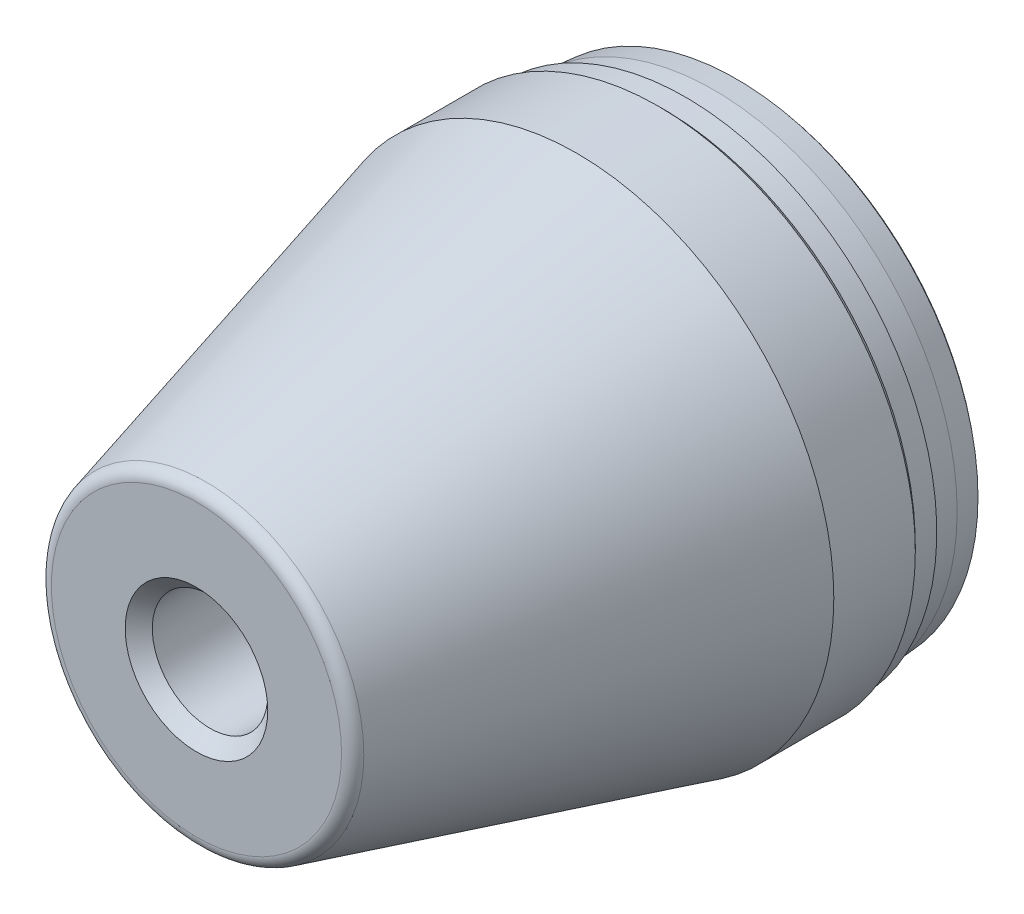
ISO-10303-21;
HEADER;
FILE_DESCRIPTION(('STEP AP214'),'2;1');
FILE_NAME('part.step','',(''),(''),'','','');
FILE_SCHEMA(('AUTOMOTIVE_DESIGN { 1 0 10303 214 1 1 1 1 }'));
ENDSEC;
DATA;
#1=APPLICATION_CONTEXT('core data for automotive mechanical design processes');
#2=APPLICATION_PROTOCOL_DEFINITION('international standard','automotive_design',2000,#1);
#3=PRODUCT_CONTEXT('',#1,'mechanical');
#4=PRODUCT('Part','Part','',(#3));
#5=PRODUCT_RELATED_PRODUCT_CATEGORY('part','',(#4));
#6=PRODUCT_DEFINITION_FORMATION('','',#4);
#7=PRODUCT_DEFINITION_CONTEXT('part definition',#1,'design');
#8=PRODUCT_DEFINITION('design','',#6,#7);
#9=PRODUCT_DEFINITION_SHAPE('','',#8);
#10=(LENGTH_UNIT() NAMED_UNIT(*) SI_UNIT(.MILLI.,.METRE.));
#11=(NAMED_UNIT(*) PLANE_ANGLE_UNIT() SI_UNIT($,.RADIAN.));
#12=(NAMED_UNIT(*) SI_UNIT($,.STERADIAN.) SOLID_ANGLE_UNIT());
#13=UNCERTAINTY_MEASURE_WITH_UNIT(LENGTH_MEASURE(1.E-05),#10,'distance_accuracy_value','');
#14=(GEOMETRIC_REPRESENTATION_CONTEXT(3) GLOBAL_UNCERTAINTY_ASSIGNED_CONTEXT((#13)) GLOBAL_UNIT_ASSIGNED_CONTEXT((#10,
#11,#12)) REPRESENTATION_CONTEXT('',''));
#15=CARTESIAN_POINT('',(0.,0.,0.));
#16=DIRECTION('',(0.,0.,1.));
#17=DIRECTION('',(1.,0.,0.));
#18=AXIS2_PLACEMENT_3D('',#15,#16,#17);
#19=CARTESIAN_POINT('',(0.,0.,0.));
#20=DIRECTION('',(0.,0.,1.));
#21=DIRECTION('',(1.,0.,0.));
#22=AXIS2_PLACEMENT_3D('',#19,#20,#21);
#23=PLANE('',#22);
#24=CARTESIAN_POINT('',(0.,0.,0.));
#25=DIRECTION('',(0.,0.,1.));
#26=DIRECTION('',(1.,0.,0.));
#27=AXIS2_PLACEMENT_3D('',#24,#25,#26);
#28=CIRCLE('',#27,8.3312);
#29=CARTESIAN_POINT('',(8.3312,0.,0.));
#30=VERTEX_POINT('',#29);
#31=EDGE_CURVE('E82',#30,#30,#28,.T.);
#32=ORIENTED_EDGE('',*,*,#31,.F.);
#33=EDGE_LOOP('',(#32));
#34=FACE_BOUND('',#33,.T.);
#35=CARTESIAN_POINT('',(0.,0.,0.));
#36=DIRECTION('',(0.,0.,1.));
#37=DIRECTION('',(1.,0.,0.));
#38=AXIS2_PLACEMENT_3D('',#35,#36,#37);
#39=CIRCLE('',#38,16.955752066757);
#40=CARTESIAN_POINT('',(16.955752066757,0.,0.));
#41=VERTEX_POINT('',#40);
#42=EDGE_CURVE('E10',#41,#41,#39,.T.);
#43=ORIENTED_EDGE('',*,*,#42,.T.);
#44=EDGE_LOOP('',(#43));
#45=FACE_BOUND('',#44,.T.);
#46=ADVANCED_FACE('F36',(#34,#45),#23,.T.);
#47=CARTESIAN_POINT('',(0.,0.,-44.45));
#48=DIRECTION('',(0.,0.,-1.));
#49=DIRECTION('',(-1.,0.,0.));
#50=AXIS2_PLACEMENT_3D('',#47,#48,#49);
#51=CONICAL_SURFACE('',#50,30.0355,0.261799387799143);
#52=CARTESIAN_POINT('',(0.,0.,-1.12955977526377));
#53=DIRECTION('',(0.,0.,1.));
#54=DIRECTION('',(1.,0.,0.));
#55=AXIS2_PLACEMENT_3D('',#52,#53,#54);
#56=CIRCLE('',#55,18.4278230260215);
#57=CARTESIAN_POINT('',(18.4278230260215,0.,-1.12955977526377));
#58=VERTEX_POINT('',#57);
#59=EDGE_CURVE('E43',#58,#58,#56,.F.);
#60=ORIENTED_EDGE('',*,*,#59,.T.);
#61=EDGE_LOOP('',(#60));
#62=FACE_BOUND('',#61,.T.);
#63=CARTESIAN_POINT('',(0.,0.,-44.45));
#64=DIRECTION('',(0.,0.,-1.));
#65=DIRECTION('',(-1.,0.,0.));
#66=AXIS2_PLACEMENT_3D('',#63,#64,#65);
#67=CIRCLE('',#66,30.0355);
#68=CARTESIAN_POINT('',(-30.0355,0.,-44.45));
#69=VERTEX_POINT('',#68);
#70=EDGE_CURVE('E64',#69,#69,#67,.T.);
#71=ORIENTED_EDGE('',*,*,#70,.F.);
#72=EDGE_LOOP('',(#71));
#73=FACE_BOUND('',#72,.T.);
#74=ADVANCED_FACE('F99',(#62,#73),#51,.T.);
#75=CARTESIAN_POINT('',(0.,0.,0.));
#76=DIRECTION('',(0.,0.,-1.));
#77=DIRECTION('',(-1.,0.,0.));
#78=AXIS2_PLACEMENT_3D('',#75,#76,#77);
#79=CYLINDRICAL_SURFACE('',#78,30.0355);
#80=ORIENTED_EDGE('',*,*,#70,.T.);
#81=EDGE_LOOP('',(#80));
#82=FACE_BOUND('',#81,.T.);
#83=CARTESIAN_POINT('',(0.,0.,-53.975));
#84=DIRECTION('',(0.,0.,-1.));
#85=DIRECTION('',(-1.,0.,0.));
#86=AXIS2_PLACEMENT_3D('',#83,#84,#85);
#87=CIRCLE('',#86,30.0355);
#88=CARTESIAN_POINT('',(-30.0355,0.,-53.975));
#89=VERTEX_POINT('',#88);
#90=EDGE_CURVE('E67',#89,#89,#87,.T.);
#91=ORIENTED_EDGE('',*,*,#90,.F.);
#92=EDGE_LOOP('',(#91));
#93=FACE_BOUND('',#92,.T.);
#94=ADVANCED_FACE('F103',(#82,#93),#79,.T.);
#95=CARTESIAN_POINT('',(0.,0.,-54.64175));
#96=DIRECTION('',(0.,0.,1.));
#97=DIRECTION('',(1.,0.,0.));
#98=AXIS2_PLACEMENT_3D('',#95,#96,#97);
#99=CONICAL_SURFACE('',#98,29.36875,0.785398163397441);
#100=ORIENTED_EDGE('',*,*,#90,.T.);
#101=EDGE_LOOP('',(#100));
#102=FACE_BOUND('',#101,.T.);
#103=CARTESIAN_POINT('',(0.,0.,-54.64175));
#104=DIRECTION('',(0.,0.,-1.));
#105=DIRECTION('',(-1.,0.,0.));
#106=AXIS2_PLACEMENT_3D('',#103,#104,#105);
#107=CIRCLE('',#106,29.36875);
#108=CARTESIAN_POINT('',(-29.36875,0.,-54.64175));
#109=VERTEX_POINT('',#108);
#110=EDGE_CURVE('E70',#109,#109,#107,.T.);
#111=ORIENTED_EDGE('',*,*,#110,.F.);
#112=EDGE_LOOP('',(#111));
#113=FACE_BOUND('',#112,.T.);
#114=ADVANCED_FACE('F108',(#102,#113),#99,.T.);
#115=CARTESIAN_POINT('',(0.,0.,0.));
#116=DIRECTION('',(0.,0.,-1.));
#117=DIRECTION('',(-1.,0.,0.));
#118=AXIS2_PLACEMENT_3D('',#115,#116,#117);
#119=CYLINDRICAL_SURFACE('',#118,29.36875);
#120=ORIENTED_EDGE('',*,*,#110,.T.);
#121=EDGE_LOOP('',(#120));
#122=FACE_BOUND('',#121,.T.);
#123=CARTESIAN_POINT('',(0.,0.,-57.15));
#124=DIRECTION('',(0.,0.,-1.));
#125=DIRECTION('',(-1.,0.,0.));
#126=AXIS2_PLACEMENT_3D('',#123,#124,#125);
#127=CIRCLE('',#126,29.36875);
#128=CARTESIAN_POINT('',(-29.36875,0.,-57.15));
#129=VERTEX_POINT('',#128);
#130=EDGE_CURVE('E73',#129,#129,#127,.T.);
#131=ORIENTED_EDGE('',*,*,#130,.F.);
#132=EDGE_LOOP('',(#131));
#133=FACE_BOUND('',#132,.T.);
#134=ADVANCED_FACE('F115',(#122,#133),#119,.T.);
#135=CARTESIAN_POINT('',(0.,29.36875,-57.15));
#136=DIRECTION('',(0.,0.,-1.));
#137=DIRECTION('',(-1.,0.,0.));
#138=AXIS2_PLACEMENT_3D('',#135,#136,#137);
#139=PLANE('',#138);
#140=ORIENTED_EDGE('',*,*,#130,.T.);
#141=EDGE_LOOP('',(#140));
#142=FACE_BOUND('',#141,.T.);
#143=CARTESIAN_POINT('',(0.,0.,-57.15));
#144=DIRECTION('',(0.,0.,-1.));
#145=DIRECTION('',(-1.,0.,0.));
#146=AXIS2_PLACEMENT_3D('',#143,#144,#145);
#147=CIRCLE('',#146,28.448);
#148=CARTESIAN_POINT('',(-28.448,0.,-57.15));
#149=VERTEX_POINT('',#148);
#150=EDGE_CURVE('E76',#149,#149,#147,.T.);
#151=ORIENTED_EDGE('',*,*,#150,.F.);
#152=EDGE_LOOP('',(#151));
#153=FACE_BOUND('',#152,.T.);
#154=ADVANCED_FACE('F119',(#142,#153),#139,.T.);
#155=CARTESIAN_POINT('',(0.,0.,0.));
#156=DIRECTION('',(0.,0.,-1.));
#157=DIRECTION('',(-1.,0.,0.));
#158=AXIS2_PLACEMENT_3D('',#155,#156,#157);
#159=CYLINDRICAL_SURFACE('',#158,28.448);
#160=CARTESIAN_POINT('',(0.,0.,-60.4519999999999));
#161=DIRECTION('',(0.,0.,-1.));
#162=DIRECTION('',(-1.,0.,0.));
#163=AXIS2_PLACEMENT_3D('',#160,#161,#162);
#164=CIRCLE('',#163,28.448);
#165=CARTESIAN_POINT('',(28.448,0.,-60.4519999999999));
#166=VERTEX_POINT('',#165);
#167=EDGE_CURVE('E61',#166,#166,#164,.F.);
#168=ORIENTED_EDGE('',*,*,#167,.T.);
#169=EDGE_LOOP('',(#168));
#170=FACE_BOUND('',#169,.T.);
#171=ORIENTED_EDGE('',*,*,#150,.T.);
#172=EDGE_LOOP('',(#171));
#173=FACE_BOUND('',#172,.T.);
#174=ADVANCED_FACE('F123',(#170,#173),#159,.T.);
#175=CARTESIAN_POINT('',(0.,28.448,-63.5));
#176=DIRECTION('',(0.,0.,-1.));
#177=DIRECTION('',(-1.,0.,0.));
#178=AXIS2_PLACEMENT_3D('',#175,#176,#177);
#179=PLANE('',#178);
#180=CARTESIAN_POINT('',(0.,0.,-63.5));
#181=DIRECTION('',(0.,0.,-1.));
#182=DIRECTION('',(-1.,0.,0.));
#183=AXIS2_PLACEMENT_3D('',#180,#181,#182);
#184=CIRCLE('',#183,27.7622106010073);
#185=CARTESIAN_POINT('',(-27.7622106010073,0.,-63.5));
#186=VERTEX_POINT('',#185);
#187=EDGE_CURVE('E55',#186,#186,#184,.T.);
#188=ORIENTED_EDGE('',*,*,#187,.T.);
#189=EDGE_LOOP('',(#188));
#190=FACE_BOUND('',#189,.T.);
#191=CARTESIAN_POINT('',(0.,0.,-63.5));
#192=DIRECTION('',(0.,0.,-1.));
#193=DIRECTION('',(-1.,0.,0.));
#194=AXIS2_PLACEMENT_3D('',#191,#192,#193);
#195=CIRCLE('',#194,24.1935);
#196=CARTESIAN_POINT('',(-24.1935,0.,-63.5));
#197=VERTEX_POINT('',#196);
#198=EDGE_CURVE('E58',#197,#197,#195,.F.);
#199=ORIENTED_EDGE('',*,*,#198,.T.);
#200=EDGE_LOOP('',(#199));
#201=FACE_BOUND('',#200,.T.);
#202=ADVANCED_FACE('F127',(#190,#201),#179,.T.);
#203=CARTESIAN_POINT('',(0.,0.,0.));
#204=DIRECTION('',(0.,0.,-1.));
#205=DIRECTION('',(-1.,0.,0.));
#206=AXIS2_PLACEMENT_3D('',#203,#204,#205);
#207=CYLINDRICAL_SURFACE('',#206,23.8125);
#208=CARTESIAN_POINT('',(0.,0.,-63.119));
#209=DIRECTION('',(0.,0.,-1.));
#210=DIRECTION('',(-1.,0.,0.));
#211=AXIS2_PLACEMENT_3D('',#208,#209,#210);
#212=CIRCLE('',#211,23.8125);
#213=CARTESIAN_POINT('',(-23.8125,0.,-63.119));
#214=VERTEX_POINT('',#213);
#215=EDGE_CURVE('E47',#214,#214,#212,.T.);
#216=ORIENTED_EDGE('',*,*,#215,.T.);
#217=EDGE_LOOP('',(#216));
#218=FACE_BOUND('',#217,.T.);
#219=CARTESIAN_POINT('',(0.,0.,-44.45));
#220=DIRECTION('',(0.,0.,-1.));
#221=DIRECTION('',(-1.,0.,0.));
#222=AXIS2_PLACEMENT_3D('',#219,#220,#221);
#223=CIRCLE('',#222,23.8125);
#224=CARTESIAN_POINT('',(-23.8125,0.,-44.45));
#225=VERTEX_POINT('',#224);
#226=EDGE_CURVE('E79',#225,#225,#223,.T.);
#227=ORIENTED_EDGE('',*,*,#226,.F.);
#228=EDGE_LOOP('',(#227));
#229=FACE_BOUND('',#228,.T.);
#230=ADVANCED_FACE('F131',(#218,#229),#207,.F.);
#231=CARTESIAN_POINT('',(0.,0.,-38.069459855234));
#232=DIRECTION('',(0.,0.,-1.));
#233=DIRECTION('',(-1.,0.,0.));
#234=AXIS2_PLACEMENT_3D('',#231,#232,#233);
#235=CONICAL_SURFACE('',#234,0.,1.30899693899575);
#236=CARTESIAN_POINT('',(0.,0.,-39.8771094151805));
#237=DIRECTION('',(0.,0.,-1.));
#238=DIRECTION('',(-1.,0.,0.));
#239=AXIS2_PLACEMENT_3D('',#236,#237,#238);
#240=CIRCLE('',#239,6.74623999999999);
#241=CARTESIAN_POINT('',(-6.74623999999999,0.,-39.8771094151805));
#242=VERTEX_POINT('',#241);
#243=EDGE_CURVE('E39',#242,#242,#240,.T.);
#244=CARTESIAN_POINT('',(-6.74623999999999,0.,-39.8771094151805));
#245=CARTESIAN_POINT('',(-6.92401354166665,0.,-39.9247436921057));
#246=CARTESIAN_POINT('',(-7.10178708333332,0.,-39.9723779690309));
#247=CARTESIAN_POINT('',(-7.45733416666665,0.,-40.0676465228813));
#248=CARTESIAN_POINT('',(-7.63510770833332,0.,-40.1152807998065));
#249=CARTESIAN_POINT('',(-7.99065479166665,0.,-40.2105493536569));
#250=CARTESIAN_POINT('',(-8.16842833333332,0.,-40.2581836305821));
#251=CARTESIAN_POINT('',(-8.52397541666665,0.,-40.3534521844325));
#252=CARTESIAN_POINT('',(-8.70174895833332,0.,-40.4010864613577));
#253=CARTESIAN_POINT('',(-9.05729604166665,0.,-40.4963550152081));
#254=CARTESIAN_POINT('',(-9.23506958333332,0.,-40.5439892921333));
#255=CARTESIAN_POINT('',(-9.59061666666665,0.,-40.6392578459837));
#256=CARTESIAN_POINT('',(-9.76839020833332,0.,-40.6868921229089));
#257=CARTESIAN_POINT('',(-10.1239372916667,0.,-40.7821606767593));
#258=CARTESIAN_POINT('',(-10.3017108333333,0.,-40.8297949536845));
#259=CARTESIAN_POINT('',(-10.6572579166667,0.,-40.925063507535));
#260=CARTESIAN_POINT('',(-10.8350314583333,0.,-40.9726977844602));
#261=CARTESIAN_POINT('',(-11.1905785416667,0.,-41.0679663383106));
#262=CARTESIAN_POINT('',(-11.3683520833333,0.,-41.1156006152358));
#263=CARTESIAN_POINT('',(-11.7238991666667,0.,-41.2108691690862));
#264=CARTESIAN_POINT('',(-11.9016727083333,0.,-41.2585034460114));
#265=CARTESIAN_POINT('',(-12.2572197916667,0.,-41.3537719998618));
#266=CARTESIAN_POINT('',(-12.4349933333333,0.,-41.401406276787));
#267=CARTESIAN_POINT('',(-12.7905404166667,0.,-41.4966748306374));
#268=CARTESIAN_POINT('',(-12.9683139583333,0.,-41.5443091075626));
#269=CARTESIAN_POINT('',(-13.3238610416667,0.,-41.639577661413));
#270=CARTESIAN_POINT('',(-13.5016345833333,0.,-41.6872119383382));
#271=CARTESIAN_POINT('',(-13.8571816666667,0.,-41.7824804921886));
#272=CARTESIAN_POINT('',(-14.0349552083333,0.,-41.8301147691138));
#273=CARTESIAN_POINT('',(-14.3905022916666,0.,-41.9253833229642));
#274=CARTESIAN_POINT('',(-14.5682758333333,0.,-41.9730175998894));
#275=CARTESIAN_POINT('',(-14.9238229166667,0.,-42.0682861537398));
#276=CARTESIAN_POINT('',(-15.1015964583333,0.,-42.115920430665));
#277=CARTESIAN_POINT('',(-15.4571435416667,0.,-42.2111889845154));
#278=CARTESIAN_POINT('',(-15.6349170833333,0.,-42.2588232614406));
#279=CARTESIAN_POINT('',(-15.9904641666667,0.,-42.3540918152911));
#280=CARTESIAN_POINT('',(-16.1682377083333,0.,-42.4017260922163));
#281=CARTESIAN_POINT('',(-16.5237847916667,0.,-42.4969946460667));
#282=CARTESIAN_POINT('',(-16.7015583333333,0.,-42.5446289229919));
#283=CARTESIAN_POINT('',(-17.0571054166667,0.,-42.6398974768423));
#284=CARTESIAN_POINT('',(-17.2348789583333,0.,-42.6875317537675));
#285=CARTESIAN_POINT('',(-17.5904260416667,0.,-42.7828003076179));
#286=CARTESIAN_POINT('',(-17.7681995833333,0.,-42.8304345845431));
#287=CARTESIAN_POINT('',(-18.1237466666667,0.,-42.9257031383935));
#288=CARTESIAN_POINT('',(-18.3015202083333,0.,-42.9733374153187));
#289=CARTESIAN_POINT('',(-18.6570672916666,0.,-43.0686059691691));
#290=CARTESIAN_POINT('',(-18.8348408333333,0.,-43.1162402460943));
#291=CARTESIAN_POINT('',(-19.1903879166667,0.,-43.2115087999447));
#292=CARTESIAN_POINT('',(-19.3681614583333,0.,-43.2591430768699));
#293=CARTESIAN_POINT('',(-19.7237085416667,0.,-43.3544116307203));
#294=CARTESIAN_POINT('',(-19.9014820833333,0.,-43.4020459076455));
#295=CARTESIAN_POINT('',(-20.2570291666667,0.,-43.4973144614959));
#296=CARTESIAN_POINT('',(-20.4348027083333,0.,-43.5449487384211));
#297=CARTESIAN_POINT('',(-20.7903497916667,0.,-43.6402172922715));
#298=CARTESIAN_POINT('',(-20.9681233333333,0.,-43.6878515691967));
#299=CARTESIAN_POINT('',(-21.3236704166667,0.,-43.7831201230471));
#300=CARTESIAN_POINT('',(-21.5014439583333,0.,-43.8307543999724));
#301=CARTESIAN_POINT('',(-21.8569910416667,0.,-43.9260229538228));
#302=CARTESIAN_POINT('',(-22.0347645833333,0.,-43.973657230748));
#303=CARTESIAN_POINT('',(-22.3903116666667,0.,-44.0689257845984));
#304=CARTESIAN_POINT('',(-22.5680852083333,0.,-44.1165600615236));
#305=CARTESIAN_POINT('',(-22.9236322916667,0.,-44.211828615374));
#306=CARTESIAN_POINT('',(-23.1014058333333,0.,-44.2594628922992));
#307=CARTESIAN_POINT('',(-23.4569529166667,0.,-44.3547314461496));
#308=CARTESIAN_POINT('',(-23.6347264583333,0.,-44.4023657230748));
#309=CARTESIAN_POINT('',(-23.8125,0.,-44.45));
#310=B_SPLINE_CURVE_WITH_KNOTS('',3,(#244,#245,#246,#247,#248,#249,#250,#251,#252,#253,#254,
#255,#256,#257,#258,#259,#260,#261,#262,#263,#264,#265,#266,#267,#268,#269,#270,#271,#272,#273,
#274,#275,#276,#277,#278,#279,#280,#281,#282,#283,#284,#285,#286,#287,#288,#289,#290,#291,#292,
#293,#294,#295,#296,#297,#298,#299,#300,#301,#302,#303,#304,#305,#306,#307,#308,#309),
.UNSPECIFIED.,.F.,.F.,(4,2,2,2,2,2,2,2,2,2,2,2,2,2,2,2,2,2,2,2,2,2,2,2,2,2,2,2,2,2,2,2,4),(0.,
0.552134139583919,1.10426827916784,1.65640241875175,2.20853655833567,2.76067069791959,
3.31280483750351,3.86493897708743,4.41707311667134,4.96920725625526,5.52134139583918,
6.0734755354231,6.62560967500701,7.17774381459093,7.72987795417485,8.28201209375877,
8.83414623334269,9.3862803729266,9.93841451251052,10.4905486520944,11.0426827916784,
11.5948169312623,12.1469510708462,12.6990852104301,13.251219350014,13.8033534895979,
14.3554876291819,14.9076217687658,15.4597559083497,16.0118900479336,16.5640241875175,
17.1161583271015,17.6682924666854),.UNSPECIFIED.);
#311=EDGE_CURVE('BSEAM135',#242,#225,#310,.T.);
#312=ORIENTED_EDGE('',*,*,#243,.F.);
#313=ORIENTED_EDGE('',*,*,#226,.T.);
#314=ORIENTED_EDGE('',*,*,#311,.T.);
#315=ORIENTED_EDGE('',*,*,#311,.F.);
#316=EDGE_LOOP('',(#312,#314,#313,#315));
#317=FACE_BOUND('',#316,.T.);
#318=ADVANCED_FACE('F135',(#317),#235,.F.);
#319=CARTESIAN_POINT('',(0.,0.,-63.5));
#320=DIRECTION('',(0.,0.,1.));
#321=DIRECTION('',(1.,0.,0.));
#322=AXIS2_PLACEMENT_3D('',#319,#320,#321);
#323=CONICAL_SURFACE('',#322,28.181334553573,0.0872664625997127);
#324=CARTESIAN_POINT('',(0.,0.,-63.1204498200271));
#325=DIRECTION('',(0.,0.,-1.));
#326=DIRECTION('',(-1.,0.,0.));
#327=AXIS2_PLACEMENT_3D('',#324,#325,#326);
#328=CIRCLE('',#327,28.2145408915599);
#329=CARTESIAN_POINT('',(28.2145408915599,0.,-63.1204498200271));
#330=VERTEX_POINT('',#329);
#331=EDGE_CURVE('E52',#330,#330,#328,.F.);
#332=CARTESIAN_POINT('',(28.2145408915599,0.,-63.1204498200271));
#333=CARTESIAN_POINT('',(28.2169727572728,0.,-63.0926534677351));
#334=CARTESIAN_POINT('',(28.2194046229857,0.,-63.0648571154432));
#335=CARTESIAN_POINT('',(28.2242683544115,0.,-63.0092644108593));
#336=CARTESIAN_POINT('',(28.2267002201244,0.,-62.9814680585673));
#337=CARTESIAN_POINT('',(28.2315639515503,0.,-62.9258753539834));
#338=CARTESIAN_POINT('',(28.2339958172632,0.,-62.8980790016915));
#339=CARTESIAN_POINT('',(28.238859548689,0.,-62.8424862971076));
#340=CARTESIAN_POINT('',(28.241291414402,0.,-62.8146899448156));
#341=CARTESIAN_POINT('',(28.2461551458278,0.,-62.7590972402317));
#342=CARTESIAN_POINT('',(28.2485870115407,0.,-62.7313008879398));
#343=CARTESIAN_POINT('',(28.2534507429665,0.,-62.6757081833559));
#344=CARTESIAN_POINT('',(28.2558826086795,0.,-62.6479118310639));
#345=CARTESIAN_POINT('',(28.2607463401053,0.,-62.59231912648));
#346=CARTESIAN_POINT('',(28.2631782058182,0.,-62.5645227741881));
#347=CARTESIAN_POINT('',(28.2680419372441,0.,-62.5089300696042));
#348=CARTESIAN_POINT('',(28.270473802957,0.,-62.4811337173122));
#349=CARTESIAN_POINT('',(28.2753375343828,0.,-62.4255410127283));
#350=CARTESIAN_POINT('',(28.2777694000957,0.,-62.3977446604364));
#351=CARTESIAN_POINT('',(28.2826331315216,0.,-62.3421519558525));
#352=CARTESIAN_POINT('',(28.2850649972345,0.,-62.3143556035605));
#353=CARTESIAN_POINT('',(28.2899287286603,0.,-62.2587628989766));
#354=CARTESIAN_POINT('',(28.2923605943732,0.,-62.2309665466847));
#355=CARTESIAN_POINT('',(28.2972243257991,0.,-62.1753738421008));
#356=CARTESIAN_POINT('',(28.299656191512,0.,-62.1475774898088));
#357=CARTESIAN_POINT('',(28.3045199229378,0.,-62.0919847852249));
#358=CARTESIAN_POINT('',(28.3069517886507,0.,-62.064188432933));
#359=CARTESIAN_POINT('',(28.3118155200766,0.,-62.0085957283491));
#360=CARTESIAN_POINT('',(28.3142473857895,0.,-61.9807993760571));
#361=CARTESIAN_POINT('',(28.3191111172153,0.,-61.9252066714732));
#362=CARTESIAN_POINT('',(28.3215429829283,0.,-61.8974103191813));
#363=CARTESIAN_POINT('',(28.3264067143541,0.,-61.8418176145974));
#364=CARTESIAN_POINT('',(28.328838580067,0.,-61.8140212623055));
#365=CARTESIAN_POINT('',(28.3337023114928,0.,-61.7584285577216));
#366=CARTESIAN_POINT('',(28.3361341772058,0.,-61.7306322054296));
#367=CARTESIAN_POINT('',(28.3409979086316,0.,-61.6750395008457));
#368=CARTESIAN_POINT('',(28.3434297743445,0.,-61.6472431485538));
#369=CARTESIAN_POINT('',(28.3482935057704,0.,-61.5916504439699));
#370=CARTESIAN_POINT('',(28.3507253714833,0.,-61.5638540916779));
#371=CARTESIAN_POINT('',(28.3555891029091,0.,-61.508261387094));
#372=CARTESIAN_POINT('',(28.358020968622,0.,-61.4804650348021));
#373=CARTESIAN_POINT('',(28.3628847000479,0.,-61.4248723302182));
#374=CARTESIAN_POINT('',(28.3653165657608,0.,-61.3970759779262));
#375=CARTESIAN_POINT('',(28.3701802971866,0.,-61.3414832733423));
#376=CARTESIAN_POINT('',(28.3726121628995,0.,-61.3136869210504));
#377=CARTESIAN_POINT('',(28.3774758943254,0.,-61.2580942164665));
#378=CARTESIAN_POINT('',(28.3799077600383,0.,-61.2302978641745));
#379=CARTESIAN_POINT('',(28.3847714914641,0.,-61.1747051595906));
#380=CARTESIAN_POINT('',(28.3872033571771,0.,-61.1469088072987));
#381=CARTESIAN_POINT('',(28.3920670886029,0.,-61.0913161027148));
#382=CARTESIAN_POINT('',(28.3944989543158,0.,-61.0635197504228));
#383=CARTESIAN_POINT('',(28.3993626857416,0.,-61.0079270458389));
#384=CARTESIAN_POINT('',(28.4017945514546,0.,-60.980130693547));
#385=CARTESIAN_POINT('',(28.4066582828804,0.,-60.9245379889631));
#386=CARTESIAN_POINT('',(28.4090901485933,0.,-60.8967416366711));
#387=CARTESIAN_POINT('',(28.4139538800192,0.,-60.8411489320872));
#388=CARTESIAN_POINT('',(28.4163857457321,0.,-60.8133525797953));
#389=CARTESIAN_POINT('',(28.4212494771579,0.,-60.7577598752114));
#390=CARTESIAN_POINT('',(28.4236813428708,0.,-60.7299635229194));
#391=CARTESIAN_POINT('',(28.4285450742967,0.,-60.6743708183355));
#392=CARTESIAN_POINT('',(28.4309769400096,0.,-60.6465744660436));
#393=CARTESIAN_POINT('',(28.4358406714354,0.,-60.5909817614597));
#394=CARTESIAN_POINT('',(28.4382725371483,0.,-60.5631854091677));
#395=CARTESIAN_POINT('',(28.4431362685742,0.,-60.5075927045838));
#396=CARTESIAN_POINT('',(28.4455681342871,0.,-60.4797963522919));
#397=CARTESIAN_POINT('',(28.448,0.,-60.4519999999999));
#398=B_SPLINE_CURVE_WITH_KNOTS('',3,(#332,#333,#334,#335,#336,#337,#338,#339,#340,#341,#342,
#343,#344,#345,#346,#347,#348,#349,#350,#351,#352,#353,#354,#355,#356,#357,#358,#359,#360,#361,
#362,#363,#364,#365,#366,#367,#368,#369,#370,#371,#372,#373,#374,#375,#376,#377,#378,#379,#380,
#381,#382,#383,#384,#385,#386,#387,#388,#389,#390,#391,#392,#393,#394,#395,#396,#397),
.UNSPECIFIED.,.F.,.F.,(4,2,2,2,2,2,2,2,2,2,2,2,2,2,2,2,2,2,2,2,2,2,2,2,2,2,2,2,2,2,2,2,4),(0.,
0.0837075895259993,0.167415179051998,0.251122768578012,0.334830358104011,0.418537947630024,
0.502245537156023,0.585953126682036,0.669660716208042,0.753368305734048,0.837075895260055,
0.920783484786061,1.00449107431207,1.08819866383807,1.17190625336408,1.25561384289009,
1.33932143241609,1.4230290219421,1.5067366114681,1.59044420099411,1.67415179052012,
1.75785938004612,1.84156696957213,1.92527455909813,2.00898214862414,2.09268973815015,
2.17639732767615,2.26010491720216,2.34381250672816,2.42752009625417,2.51122768578018,
2.59493527530618,2.67864286483219),.UNSPECIFIED.);
#399=EDGE_CURVE('BSEAM139',#330,#166,#398,.T.);
#400=ORIENTED_EDGE('',*,*,#331,.T.);
#401=ORIENTED_EDGE('',*,*,#167,.F.);
#402=ORIENTED_EDGE('',*,*,#399,.T.);
#403=ORIENTED_EDGE('',*,*,#399,.F.);
#404=EDGE_LOOP('',(#400,#402,#401,#403));
#405=FACE_BOUND('',#404,.T.);
#406=ADVANCED_FACE('F139',(#405),#323,.T.);
#407=CARTESIAN_POINT('',(0.,0.,-63.5));
#408=DIRECTION('',(0.,0.,1.));
#409=DIRECTION('',(1.,0.,0.));
#410=AXIS2_PLACEMENT_3D('',#407,#408,#409);
#411=CONICAL_SURFACE('',#410,27.7622106010073,0.872664625997151);
#412=ORIENTED_EDGE('',*,*,#331,.F.);
#413=EDGE_LOOP('',(#412));
#414=FACE_BOUND('',#413,.T.);
#415=ORIENTED_EDGE('',*,*,#187,.F.);
#416=EDGE_LOOP('',(#415));
#417=FACE_BOUND('',#416,.T.);
#418=ADVANCED_FACE('F143',(#414,#417),#411,.T.);
#419=CARTESIAN_POINT('',(0.,0.,-63.119));
#420=DIRECTION('',(0.,0.,-1.));
#421=DIRECTION('',(-1.,0.,0.));
#422=AXIS2_PLACEMENT_3D('',#419,#420,#421);
#423=CONICAL_SURFACE('',#422,23.8125,0.785398163397444);
#424=CARTESIAN_POINT('',(-24.1935,0.,-63.5));
#425=CARTESIAN_POINT('',(-24.18953125,0.,-63.49603125));
#426=CARTESIAN_POINT('',(-24.1855625,0.,-63.4920625));
#427=CARTESIAN_POINT('',(-24.177625,0.,-63.484125));
#428=CARTESIAN_POINT('',(-24.17365625,0.,-63.48015625));
#429=CARTESIAN_POINT('',(-24.16571875,0.,-63.47221875));
#430=CARTESIAN_POINT('',(-24.16175,0.,-63.46825));
#431=CARTESIAN_POINT('',(-24.1538125,0.,-63.4603125));
#432=CARTESIAN_POINT('',(-24.14984375,0.,-63.45634375));
#433=CARTESIAN_POINT('',(-24.14190625,0.,-63.44840625));
#434=CARTESIAN_POINT('',(-24.1379375,0.,-63.4444375));
#435=CARTESIAN_POINT('',(-24.13,0.,-63.4365));
#436=CARTESIAN_POINT('',(-24.12603125,0.,-63.43253125));
#437=CARTESIAN_POINT('',(-24.11809375,0.,-63.42459375));
#438=CARTESIAN_POINT('',(-24.114125,0.,-63.420625));
#439=CARTESIAN_POINT('',(-24.1061875,0.,-63.4126875));
#440=CARTESIAN_POINT('',(-24.10221875,0.,-63.40871875));
#441=CARTESIAN_POINT('',(-24.09428125,0.,-63.40078125));
#442=CARTESIAN_POINT('',(-24.0903125,0.,-63.3968125));
#443=CARTESIAN_POINT('',(-24.082375,0.,-63.388875));
#444=CARTESIAN_POINT('',(-24.07840625,0.,-63.38490625));
#445=CARTESIAN_POINT('',(-24.07046875,0.,-63.37696875));
#446=CARTESIAN_POINT('',(-24.0665,0.,-63.373));
#447=CARTESIAN_POINT('',(-24.0585625,0.,-63.3650625));
#448=CARTESIAN_POINT('',(-24.05459375,0.,-63.36109375));
#449=CARTESIAN_POINT('',(-24.04665625,0.,-63.35315625));
#450=CARTESIAN_POINT('',(-24.0426875,0.,-63.3491875));
#451=CARTESIAN_POINT('',(-24.03475,0.,-63.34125));
#452=CARTESIAN_POINT('',(-24.03078125,0.,-63.33728125));
#453=CARTESIAN_POINT('',(-24.02284375,0.,-63.32934375));
#454=CARTESIAN_POINT('',(-24.018875,0.,-63.325375));
#455=CARTESIAN_POINT('',(-24.0109375,0.,-63.3174375));
#456=CARTESIAN_POINT('',(-24.00696875,0.,-63.31346875));
#457=CARTESIAN_POINT('',(-23.99903125,0.,-63.30553125));
#458=CARTESIAN_POINT('',(-23.9950625,0.,-63.3015625));
#459=CARTESIAN_POINT('',(-23.987125,0.,-63.293625));
#460=CARTESIAN_POINT('',(-23.98315625,0.,-63.28965625));
#461=CARTESIAN_POINT('',(-23.97521875,0.,-63.28171875));
#462=CARTESIAN_POINT('',(-23.97125,0.,-63.27775));
#463=CARTESIAN_POINT('',(-23.9633125,0.,-63.2698125));
#464=CARTESIAN_POINT('',(-23.95934375,0.,-63.26584375));
#465=CARTESIAN_POINT('',(-23.95140625,0.,-63.25790625));
#466=CARTESIAN_POINT('',(-23.9474375,0.,-63.2539375));
#467=CARTESIAN_POINT('',(-23.9395,0.,-63.246));
#468=CARTESIAN_POINT('',(-23.93553125,0.,-63.24203125));
#469=CARTESIAN_POINT('',(-23.92759375,0.,-63.23409375));
#470=CARTESIAN_POINT('',(-23.923625,0.,-63.230125));
#471=CARTESIAN_POINT('',(-23.9156875,0.,-63.2221875));
#472=CARTESIAN_POINT('',(-23.91171875,0.,-63.21821875));
#473=CARTESIAN_POINT('',(-23.90378125,0.,-63.21028125));
#474=CARTESIAN_POINT('',(-23.8998125,0.,-63.2063125));
#475=CARTESIAN_POINT('',(-23.891875,0.,-63.198375));
#476=CARTESIAN_POINT('',(-23.88790625,0.,-63.19440625));
#477=CARTESIAN_POINT('',(-23.87996875,0.,-63.18646875));
#478=CARTESIAN_POINT('',(-23.876,0.,-63.1825));
#479=CARTESIAN_POINT('',(-23.8680625,0.,-63.1745625));
#480=CARTESIAN_POINT('',(-23.86409375,0.,-63.17059375));
#481=CARTESIAN_POINT('',(-23.85615625,0.,-63.16265625));
#482=CARTESIAN_POINT('',(-23.8521875,0.,-63.1586875));
#483=CARTESIAN_POINT('',(-23.84425,0.,-63.15075));
#484=CARTESIAN_POINT('',(-23.84028125,0.,-63.14678125));
#485=CARTESIAN_POINT('',(-23.83234375,0.,-63.13884375));
#486=CARTESIAN_POINT('',(-23.828375,0.,-63.134875));
#487=CARTESIAN_POINT('',(-23.8204375,0.,-63.1269375));
#488=CARTESIAN_POINT('',(-23.81646875,0.,-63.12296875));
#489=CARTESIAN_POINT('',(-23.8125,0.,-63.119));
#490=B_SPLINE_CURVE_WITH_KNOTS('',3,(#424,#425,#426,#427,#428,#429,#430,#431,#432,#433,#434,
#435,#436,#437,#438,#439,#440,#441,#442,#443,#444,#445,#446,#447,#448,#449,#450,#451,#452,#453,
#454,#455,#456,#457,#458,#459,#460,#461,#462,#463,#464,#465,#466,#467,#468,#469,#470,#471,#472,
#473,#474,#475,#476,#477,#478,#479,#480,#481,#482,#483,#484,#485,#486,#487,#488,#489),
.UNSPECIFIED.,.F.,.F.,(4,2,2,2,2,2,2,2,2,2,2,2,2,2,2,2,2,2,2,2,2,2,2,2,2,2,2,2,2,2,2,2,4),(0.,
0.0168379802270031,0.0336759604540087,0.0505139406810118,0.0673519209080149,0.0841899011350204,
0.101027881362024,0.117865861589027,0.134703841816032,0.151541822043035,0.168379802270038,
0.185217782497054,0.202055762724057,0.21889374295106,0.235731723178065,0.252569703405069,
0.269407683632072,0.286245663859077,0.30308364408608,0.319921624313086,0.336759604540089,
0.353597584767092,0.370435564994107,0.387273545221111,0.404111525448114,0.420949505675119,
0.437787485902122,0.454625466129125,0.471463446356131,0.488301426583134,0.505139406810137,
0.521977387037143,0.538815367264146),.UNSPECIFIED.);
#491=EDGE_CURVE('BSEAM147',#197,#214,#490,.T.);
#492=ORIENTED_EDGE('',*,*,#198,.F.);
#493=ORIENTED_EDGE('',*,*,#215,.F.);
#494=ORIENTED_EDGE('',*,*,#491,.T.);
#495=ORIENTED_EDGE('',*,*,#491,.F.);
#496=EDGE_LOOP('',(#492,#494,#493,#495));
#497=FACE_BOUND('',#496,.T.);
#498=ADVANCED_FACE('F147',(#497),#423,.F.);
#499=CARTESIAN_POINT('',(0.,0.,-1.524));
#500=DIRECTION('',(0.,0.,1.));
#501=DIRECTION('',(1.,0.,0.));
#502=AXIS2_PLACEMENT_3D('',#499,#500,#501);
#503=TOROIDAL_SURFACE('',#502,16.955752066757,1.524);
#504=ORIENTED_EDGE('',*,*,#42,.F.);
#505=EDGE_LOOP('',(#504));
#506=FACE_BOUND('',#505,.T.);
#507=ORIENTED_EDGE('',*,*,#59,.F.);
#508=EDGE_LOOP('',(#507));
#509=FACE_BOUND('',#508,.T.);
#510=ADVANCED_FACE('F94',(#506,#509),#503,.T.);
#511=CARTESIAN_POINT('',(0.,0.,0.));
#512=DIRECTION('',(0.,0.,1.));
#513=DIRECTION('',(1.,0.,0.));
#514=AXIS2_PLACEMENT_3D('',#511,#512,#513);
#515=CONICAL_SURFACE('',#514,8.3312,0.785398163397454);
#516=CARTESIAN_POINT('',(0.,0.,-1.58495999999998));
#517=DIRECTION('',(0.,0.,1.));
#518=DIRECTION('',(1.,0.,0.));
#519=AXIS2_PLACEMENT_3D('',#516,#517,#518);
#520=CIRCLE('',#519,6.74624);
#521=CARTESIAN_POINT('',(6.74624,0.,-1.58495999999998));
#522=VERTEX_POINT('',#521);
#523=EDGE_CURVE('E85',#522,#522,#520,.T.);
#524=ORIENTED_EDGE('',*,*,#523,.F.);
#525=EDGE_LOOP('',(#524));
#526=FACE_BOUND('',#525,.T.);
#527=ORIENTED_EDGE('',*,*,#31,.T.);
#528=EDGE_LOOP('',(#527));
#529=FACE_BOUND('',#528,.T.);
#530=ADVANCED_FACE('F91',(#526,#529),#515,.F.);
#531=CARTESIAN_POINT('',(0.,0.,0.));
#532=DIRECTION('',(0.,0.,1.));
#533=DIRECTION('',(1.,0.,0.));
#534=AXIS2_PLACEMENT_3D('',#531,#532,#533);
#535=CYLINDRICAL_SURFACE('',#534,6.74623999999999);
#536=ORIENTED_EDGE('',*,*,#243,.T.);
#537=EDGE_LOOP('',(#536));
#538=FACE_BOUND('',#537,.T.);
#539=ORIENTED_EDGE('',*,*,#523,.T.);
#540=EDGE_LOOP('',(#539));
#541=FACE_BOUND('',#540,.T.);
#542=ADVANCED_FACE('F89',(#538,#541),#535,.F.);
#543=CLOSED_SHELL('',(#46,#74,#94,#114,#134,#154,#174,#202,#230,#318,#406,#418,#498,#510,#530,#542));
#544=MANIFOLD_SOLID_BREP('B2',#543);
#545=ADVANCED_BREP_SHAPE_REPRESENTATION('',(#18,#544),#14);
#546=SHAPE_DEFINITION_REPRESENTATION(#9,#545);
ENDSEC;
END-ISO-10303-21;
